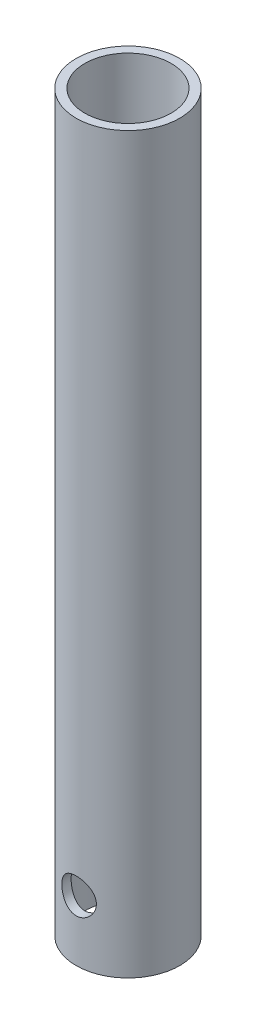
ISO-10303-21;
HEADER;
FILE_DESCRIPTION(('STEP AP214'),'2;1');
FILE_NAME('part.step','',(''),(''),'','','');
FILE_SCHEMA(('AUTOMOTIVE_DESIGN { 1 0 10303 214 1 1 1 1 }'));
ENDSEC;
DATA;
#1=APPLICATION_CONTEXT('core data for automotive mechanical design processes');
#2=APPLICATION_PROTOCOL_DEFINITION('international standard','automotive_design',2000,#1);
#3=PRODUCT_CONTEXT('',#1,'mechanical');
#4=PRODUCT('Part','Part','',(#3));
#5=PRODUCT_RELATED_PRODUCT_CATEGORY('part','',(#4));
#6=PRODUCT_DEFINITION_FORMATION('','',#4);
#7=PRODUCT_DEFINITION_CONTEXT('part definition',#1,'design');
#8=PRODUCT_DEFINITION('design','',#6,#7);
#9=PRODUCT_DEFINITION_SHAPE('','',#8);
#10=(LENGTH_UNIT() NAMED_UNIT(*) SI_UNIT(.MILLI.,.METRE.));
#11=(NAMED_UNIT(*) PLANE_ANGLE_UNIT() SI_UNIT($,.RADIAN.));
#12=(NAMED_UNIT(*) SI_UNIT($,.STERADIAN.) SOLID_ANGLE_UNIT());
#13=UNCERTAINTY_MEASURE_WITH_UNIT(LENGTH_MEASURE(1.E-05),#10,'distance_accuracy_value','');
#14=(GEOMETRIC_REPRESENTATION_CONTEXT(3) GLOBAL_UNCERTAINTY_ASSIGNED_CONTEXT((#13)) GLOBAL_UNIT_ASSIGNED_CONTEXT((#10,
#11,#12)) REPRESENTATION_CONTEXT('',''));
#15=CARTESIAN_POINT('',(0.,0.,0.));
#16=DIRECTION('',(0.,0.,1.));
#17=DIRECTION('',(1.,0.,0.));
#18=AXIS2_PLACEMENT_3D('',#15,#16,#17);
#19=CARTESIAN_POINT('',(0.,85.,0.));
#20=DIRECTION('',(0.,1.,0.));
#21=DIRECTION('',(0.,0.,1.));
#22=AXIS2_PLACEMENT_3D('',#19,#20,#21);
#23=PLANE('',#22);
#24=CARTESIAN_POINT('',(0.,85.,0.));
#25=DIRECTION('',(0.,1.,0.));
#26=DIRECTION('',(0.,0.,1.));
#27=AXIS2_PLACEMENT_3D('',#24,#25,#26);
#28=CIRCLE('',#27,6.);
#29=CARTESIAN_POINT('',(0.,85.,6.));
#30=VERTEX_POINT('',#29);
#31=EDGE_CURVE('E11',#30,#30,#28,.T.);
#32=ORIENTED_EDGE('',*,*,#31,.T.);
#33=EDGE_LOOP('',(#32));
#34=FACE_BOUND('',#33,.T.);
#35=CARTESIAN_POINT('',(0.,85.,0.));
#36=DIRECTION('',(0.,1.,0.));
#37=DIRECTION('',(1.,0.,0.));
#38=AXIS2_PLACEMENT_3D('',#35,#36,#37);
#39=CIRCLE('',#38,5.);
#40=CARTESIAN_POINT('',(5.,85.,0.));
#41=VERTEX_POINT('',#40);
#42=EDGE_CURVE('E58',#41,#41,#39,.T.);
#43=ORIENTED_EDGE('',*,*,#42,.F.);
#44=EDGE_LOOP('',(#43));
#45=FACE_BOUND('',#44,.T.);
#46=ADVANCED_FACE('F39',(#34,#45),#23,.T.);
#47=CARTESIAN_POINT('',(0.,0.,0.));
#48=DIRECTION('',(0.,1.,0.));
#49=DIRECTION('',(0.,0.,1.));
#50=AXIS2_PLACEMENT_3D('',#47,#48,#49);
#51=PLANE('',#50);
#52=CARTESIAN_POINT('',(0.,0.,0.));
#53=DIRECTION('',(0.,1.,0.));
#54=DIRECTION('',(0.,0.,1.));
#55=AXIS2_PLACEMENT_3D('',#52,#53,#54);
#56=CIRCLE('',#55,6.);
#57=CARTESIAN_POINT('',(0.,0.,6.));
#58=VERTEX_POINT('',#57);
#59=EDGE_CURVE('E53',#58,#58,#56,.T.);
#60=ORIENTED_EDGE('',*,*,#59,.F.);
#61=EDGE_LOOP('',(#60));
#62=FACE_BOUND('',#61,.T.);
#63=CARTESIAN_POINT('',(0.,0.,0.));
#64=DIRECTION('',(0.,1.,0.));
#65=DIRECTION('',(1.,0.,0.));
#66=AXIS2_PLACEMENT_3D('',#63,#64,#65);
#67=CIRCLE('',#66,5.);
#68=CARTESIAN_POINT('',(5.,0.,0.));
#69=VERTEX_POINT('',#68);
#70=EDGE_CURVE('E61',#69,#69,#67,.T.);
#71=ORIENTED_EDGE('',*,*,#70,.T.);
#72=EDGE_LOOP('',(#71));
#73=FACE_BOUND('',#72,.T.);
#74=ADVANCED_FACE('F97',(#62,#73),#51,.F.);
#75=CARTESIAN_POINT('',(0.,85.,0.));
#76=DIRECTION('',(0.,-1.,0.));
#77=DIRECTION('',(0.,0.,-1.));
#78=AXIS2_PLACEMENT_3D('',#75,#76,#77);
#79=CYLINDRICAL_SURFACE('',#78,6.);
#80=CARTESIAN_POINT('',(0.,8.99999999999998,-6.));
#81=CARTESIAN_POINT('',(-0.109126725773448,9.00000050746326,-6.00000030601888));
#82=CARTESIAN_POINT('',(-0.218250389077102,8.99103946774556,-5.9969953901509));
#83=CARTESIAN_POINT('',(-0.433283521745947,8.95554178236557,-5.98530420406562));
#84=CARTESIAN_POINT('',(-0.539192656237637,8.92900331210216,-5.97661734404305));
#85=CARTESIAN_POINT('',(-0.744665579003553,8.85936151323191,-5.95450615812885));
#86=CARTESIAN_POINT('',(-0.844239651772069,8.81628587508146,-5.94108975461707));
#87=CARTESIAN_POINT('',(-1.03474987361065,8.71491765432331,-5.91088891434684));
#88=CARTESIAN_POINT('',(-1.12568431391741,8.6566220699948,-5.89410381335556));
#89=CARTESIAN_POINT('',(-1.29948335004454,8.5243483902825,-5.8582818888601));
#90=CARTESIAN_POINT('',(-1.38200740059662,8.44993753147902,-5.8391911292757));
#91=CARTESIAN_POINT('',(-1.53366538540417,8.28846569058687,-5.80120629566243));
#92=CARTESIAN_POINT('',(-1.60279637097893,8.20140193014298,-5.78231226581098));
#93=CARTESIAN_POINT('',(-1.72764988445572,8.01402976960708,-5.74626664954547));
#94=CARTESIAN_POINT('',(-1.78292971644207,7.91341252053576,-5.72918078551376));
#95=CARTESIAN_POINT('',(-1.87563774775545,7.70364781108291,-5.69950610837202));
#96=CARTESIAN_POINT('',(-1.91307139477353,7.59450296567451,-5.68691592321491));
#97=CARTESIAN_POINT('',(-1.96774692301833,7.37465355700658,-5.66822606538754));
#98=CARTESIAN_POINT('',(-1.98562689654354,7.26412558302187,-5.66192191539222));
#99=CARTESIAN_POINT('',(-2.00268224666896,7.04147249168824,-5.65591313259015));
#100=CARTESIAN_POINT('',(-2.00186340320944,6.92934787858162,-5.6562064604546));
#101=CARTESIAN_POINT('',(-1.98203980740684,6.71212673911196,-5.6631803001636));
#102=CARTESIAN_POINT('',(-1.963867826334,6.60694319416196,-5.66956831735066));
#103=CARTESIAN_POINT('',(-1.91121232569884,6.40121316078633,-5.68753315449102));
#104=CARTESIAN_POINT('',(-1.87672685318375,6.30066722912986,-5.69911059568215));
#105=CARTESIAN_POINT('',(-1.79187811612043,6.10517450081704,-5.72635822262497));
#106=CARTESIAN_POINT('',(-1.74126809741453,6.01034394906095,-5.74209131586235));
#107=CARTESIAN_POINT('',(-1.62577821260628,5.83025818344054,-5.77585117151453));
#108=CARTESIAN_POINT('',(-1.56089422472802,5.74500574613323,-5.79387859580927));
#109=CARTESIAN_POINT('',(-1.41469866536448,5.58181680367845,-5.83134658335482));
#110=CARTESIAN_POINT('',(-1.33270630015263,5.50449461098186,-5.85081178709686));
#111=CARTESIAN_POINT('',(-1.15667913994013,5.3645374666732,-5.88813876774073));
#112=CARTESIAN_POINT('',(-1.06264319132163,5.301903923671,-5.90600039076135));
#113=CARTESIAN_POINT('',(-0.86389522609254,5.19260739952986,-5.93834215875587));
#114=CARTESIAN_POINT('',(-0.759086552832677,5.14610901731853,-5.95278700016078));
#115=CARTESIAN_POINT('',(-0.542538166729019,5.07159365208857,-5.9764113428887));
#116=CARTESIAN_POINT('',(-0.43080087630991,5.04357024915312,-5.98559267309759));
#117=CARTESIAN_POINT('',(-0.20876765905861,5.00788866795528,-5.99735254142881));
#118=CARTESIAN_POINT('',(-0.0986191997296947,4.99940038165449,-6.00020003667456));
#119=CARTESIAN_POINT('',(0.121550139920473,5.00066534719693,-5.99977805389655));
#120=CARTESIAN_POINT('',(0.2315710386393,5.01041551995975,-5.99650960838725));
#121=CARTESIAN_POINT('',(0.44503973260851,5.04722381547191,-5.98440049434209));
#122=CARTESIAN_POINT('',(0.548585613669686,5.07377241209898,-5.97572397422385));
#123=CARTESIAN_POINT('',(0.749711917159147,5.14278688893345,-5.9538369366014));
#124=CARTESIAN_POINT('',(0.847291577017213,5.18525479893556,-5.9406258409335));
#125=CARTESIAN_POINT('',(1.03657659278655,5.28614086368157,-5.91057862574579));
#126=CARTESIAN_POINT('',(1.12805991843429,5.34494918656633,-5.89365629511572));
#127=CARTESIAN_POINT('',(1.30012966027117,5.47638830002696,-5.85810507832525));
#128=CARTESIAN_POINT('',(1.38071273559116,5.54902331206352,-5.83947567187655));
#129=CARTESIAN_POINT('',(1.5325050156126,5.70995750201317,-5.80153695960889));
#130=CARTESIAN_POINT('',(1.60312193849154,5.79881845385372,-5.78223522174856));
#131=CARTESIAN_POINT('',(1.72851504464715,5.98754313562177,-5.74599946589417));
#132=CARTESIAN_POINT('',(1.78329109586203,6.08740695726815,-5.72906546764005));
#133=CARTESIAN_POINT('',(1.87519386083273,6.29534603057979,-5.69964783582767));
#134=CARTESIAN_POINT('',(1.91235626433005,6.40340415833753,-5.68715521585958));
#135=CARTESIAN_POINT('',(1.96778933351872,6.62475730008826,-5.66821664612899));
#136=CARTESIAN_POINT('',(1.98606850990788,6.7380499308087,-5.66176797247279));
#137=CARTESIAN_POINT('',(2.00255256495469,6.96039419208183,-5.65595717748354));
#138=CARTESIAN_POINT('',(2.0017405146168,7.06936468057364,-5.6562480051483));
#139=CARTESIAN_POINT('',(1.98248458689739,7.28553014984412,-5.66302539647735));
#140=CARTESIAN_POINT('',(1.96404175891718,7.39272523591018,-5.66951159138723));
#141=CARTESIAN_POINT('',(1.9107436262587,7.60027132600494,-5.68769048609783));
#142=CARTESIAN_POINT('',(1.87620669203103,7.70071365000899,-5.69928196044955));
#143=CARTESIAN_POINT('',(1.7919587315195,7.89445481387654,-5.72632797636937));
#144=CARTESIAN_POINT('',(1.74224433710762,7.98775206237601,-5.74178337526786));
#145=CARTESIAN_POINT('',(1.62652138516686,8.16896733984582,-5.77565658452093));
#146=CARTESIAN_POINT('',(1.55989648552917,8.25647300379677,-5.79417423284274));
#147=CARTESIAN_POINT('',(1.4132857662713,8.4193796267684,-5.83166712566506));
#148=CARTESIAN_POINT('',(1.33329616890297,8.49477715137615,-5.85064249824745));
#149=CARTESIAN_POINT('',(1.15848311384138,8.63428882457836,-5.88780061051088));
#150=CARTESIAN_POINT('',(1.06320302699946,8.697848695502,-5.90592363602513));
#151=CARTESIAN_POINT('',(0.862714714813253,8.8079808577013,-5.93851982345224));
#152=CARTESIAN_POINT('',(0.757509036264701,8.85455749184409,-5.9529939181586));
#153=CARTESIAN_POINT('',(0.544987294401957,8.92744326497735,-5.97611030137084));
#154=CARTESIAN_POINT('',(0.437975515352823,8.95456493252676,-5.98498424845045));
#155=CARTESIAN_POINT('',(0.220640832020498,8.99084056135425,-5.99692814128444));
#156=CARTESIAN_POINT('',(0.110318851137495,8.99999948699306,-5.9999996906381));
#157=CARTESIAN_POINT('',(0.,8.99999999999998,-6.));
#158=B_SPLINE_CURVE_WITH_KNOTS('',3,(#80,#81,#82,#83,#84,#85,#86,#87,#88,#89,#90,#91,#92,#93,
#94,#95,#96,#97,#98,#99,#100,#101,#102,#103,#104,#105,#106,#107,#108,#109,#110,#111,#112,#113,
#114,#115,#116,#117,#118,#119,#120,#121,#122,#123,#124,#125,#126,#127,#128,#129,#130,#131,#132,
#133,#134,#135,#136,#137,#138,#139,#140,#141,#142,#143,#144,#145,#146,#147,#148,#149,#150,#151,
#152,#153,#154,#155,#156,#157),.UNSPECIFIED.,.T.,.F.,(4,2,2,2,2,2,2,2,2,2,2,2,2,2,2,2,2,2,2,2,2,
2,2,2,2,2,2,2,2,2,2,2,2,2,2,2,2,2,4),(0.,0.326974212052023,0.653982370535041,0.980445345740547,
1.3069727555982,1.64369368565512,1.98048866575061,2.32696769646941,2.67334089385667,
3.00803851483681,3.34263267974971,3.66193653102561,3.98127861710965,4.30576342310262,
4.63034205116415,4.97186611622735,5.31342291933238,5.65836811300716,6.00319337754418,
6.33307166350341,6.66289426328354,6.98316315956428,7.30347290568209,7.63220799687474,
7.96104361643784,8.30482045761506,8.64860016469995,8.99168027653543,9.33460569411682,
9.65991332128519,9.98520158702753,10.3043117416084,10.6234927635196,10.9566013338361,
11.2898042224756,11.635993216702,11.9820936230492,12.3127311674763,12.6432773207628),.UNSPECIFIED.);
#159=CARTESIAN_POINT('',(0.,8.99999999999998,-6.));
#160=VERTEX_POINT('',#159);
#161=EDGE_CURVE('E86',#160,#160,#158,.T.);
#162=ORIENTED_EDGE('',*,*,#161,.T.);
#163=EDGE_LOOP('',(#162));
#164=FACE_BOUND('',#163,.T.);
#165=CARTESIAN_POINT('',(2.00000000000001,7.,5.65685424949238));
#166=CARTESIAN_POINT('',(2.00000051589543,6.89106365032786,5.65685389060868));
#167=CARTESIAN_POINT('',(1.99106956737105,6.78213040035281,5.66003538581715));
#168=CARTESIAN_POINT('',(1.95570226337762,6.5674911580115,5.6723514816251));
#169=CARTESIAN_POINT('',(1.9292630243368,6.46178570025506,5.68148706284377));
#170=CARTESIAN_POINT('',(1.85991097136981,6.25674621400542,5.70456407377583));
#171=CARTESIAN_POINT('',(1.8170304428065,6.15740014111457,5.71849607942643));
#172=CARTESIAN_POINT('',(1.71612325688277,5.96727990290408,5.74958244020649));
#173=CARTESIAN_POINT('',(1.65809325772037,5.87650763489273,5.76673750607225));
#174=CARTESIAN_POINT('',(1.52610229288576,5.70256007532337,5.80308978814946));
#175=CARTESIAN_POINT('',(1.45164868275584,5.61976914265654,5.82233789689288));
#176=CARTESIAN_POINT('',(1.28997533442879,5.46758639755072,5.86027729602006));
#177=CARTESIAN_POINT('',(1.20275355010476,5.39819673683526,5.87896849657923));
#178=CARTESIAN_POINT('',(1.01520901593002,5.27304220534081,5.91427733843598));
#179=CARTESIAN_POINT('',(0.914603822449054,5.21768005876408,5.93082815403211));
#180=CARTESIAN_POINT('',(0.704862445974951,5.12481682974497,5.95939173541966));
#181=CARTESIAN_POINT('',(0.595728571374427,5.08731093364618,5.97140572406004));
#182=CARTESIAN_POINT('',(0.376057634866991,5.03252829073521,5.98918150863813));
#183=CARTESIAN_POINT('',(0.265701509705939,5.01459310748598,5.99514629555118));
#184=CARTESIAN_POINT('',(0.0433957496481806,4.99736741327867,6.00087216436496));
#185=CARTESIAN_POINT('',(-0.0685534670877913,4.99807209669517,6.00063484525791));
#186=CARTESIAN_POINT('',(-0.286207030387629,5.01768850913205,5.99412079237463));
#187=CARTESIAN_POINT('',(-0.391984097183313,5.03588505694897,5.98808129510235));
#188=CARTESIAN_POINT('',(-0.598886877644344,5.08878596196094,5.97093934679463));
#189=CARTESIAN_POINT('',(-0.700012275558432,5.12349143795964,5.95983655262364));
#190=CARTESIAN_POINT('',(-0.896304949683947,5.20884263461211,5.93351340586449));
#191=CARTESIAN_POINT('',(-0.991376441937692,5.25969187709302,5.91824085048031));
#192=CARTESIAN_POINT('',(-1.17184865105465,5.37571941089731,5.88516786077838));
#193=CARTESIAN_POINT('',(-1.25724666877069,5.44090168665525,5.86736672402934));
#194=CARTESIAN_POINT('',(-1.42020173310262,5.58734878691939,5.83012383699793));
#195=CARTESIAN_POINT('',(-1.49720031413055,5.66922631568296,5.81064430337755));
#196=CARTESIAN_POINT('',(-1.63655451919635,5.84489745145323,5.77294670497801));
#197=CARTESIAN_POINT('',(-1.69890788656309,5.93869289145608,5.75472883491231));
#198=CARTESIAN_POINT('',(-1.80797491007149,6.13730725120688,5.72141050242224));
#199=CARTESIAN_POINT('',(-1.85445292724268,6.24226426263554,5.70635818569496));
#200=CARTESIAN_POINT('',(-1.92888638653868,6.45914278842883,5.68163301648769));
#201=CARTESIAN_POINT('',(-1.95684959149499,6.57106136241249,5.67195790974185));
#202=CARTESIAN_POINT('',(-1.99232256419505,6.79327671082315,5.6595927263117));
#203=CARTESIAN_POINT('',(-2.00069819101527,6.90341884949731,5.65660720637512));
#204=CARTESIAN_POINT('',(-1.99921087781944,7.12355229822821,5.65713344118369));
#205=CARTESIAN_POINT('',(-1.98935125045353,7.23354363204797,5.66064401583629));
#206=CARTESIAN_POINT('',(-1.95245130310463,7.44631393142382,5.67347236180599));
#207=CARTESIAN_POINT('',(-1.92601278796137,7.54921086030168,5.68258650881681));
#208=CARTESIAN_POINT('',(-1.85742772512094,7.74908721247837,5.70537107342046));
#209=CARTESIAN_POINT('',(-1.81527839272685,7.84606558318156,5.71904229869679));
#210=CARTESIAN_POINT('',(-1.71494868147788,8.034760841694,5.74993755191574));
#211=CARTESIAN_POINT('',(-1.656302236717,8.1262132852836,5.76726051331257));
#212=CARTESIAN_POINT('',(-1.52517126111512,8.29829210476744,5.8033153746193));
#213=CARTESIAN_POINT('',(-1.45268265099757,8.37891527732244,5.82204768887589));
#214=CARTESIAN_POINT('',(-1.29178341180066,8.53105596818128,5.85990077275698));
#215=CARTESIAN_POINT('',(-1.20277454109331,8.6019487800377,5.87899687155793));
#216=CARTESIAN_POINT('',(-1.01365458280052,8.72783228469609,5.91453703226218));
#217=CARTESIAN_POINT('',(-0.913543889729109,8.78282354232485,5.93098118835389));
#218=CARTESIAN_POINT('',(-0.705559724864595,8.87484020972343,5.95928811621206));
#219=CARTESIAN_POINT('',(-0.597742246642396,8.91198255429613,5.97118060009062));
#220=CARTESIAN_POINT('',(-0.376916931692035,8.96745548412021,5.98917221675549));
#221=CARTESIAN_POINT('',(-0.263910983907781,8.98579285976101,5.99527344068038));
#222=CARTESIAN_POINT('',(-0.0416306717200834,9.00252415521129,6.00083726472513));
#223=CARTESIAN_POINT('',(0.0675694478400361,9.00181490786476,6.00059840178878));
#224=CARTESIAN_POINT('',(0.284222290000347,8.98268538370719,5.99424393038796));
#225=CARTESIAN_POINT('',(0.391675153638113,8.96426654369447,5.98812879867152));
#226=CARTESIAN_POINT('',(0.600084238864117,8.91083553084808,5.97081829908825));
#227=CARTESIAN_POINT('',(0.701116541825578,8.87609156929414,5.95970516722297));
#228=CARTESIAN_POINT('',(0.895956701879591,8.7912449378057,5.9335432140899));
#229=CARTESIAN_POINT('',(0.989763248284865,8.74113948960598,5.91849368096033));
#230=CARTESIAN_POINT('',(1.17126803261757,8.62486097579599,5.88531737655762));
#231=CARTESIAN_POINT('',(1.25861250311522,8.55816262923672,5.86709744983853));
#232=CARTESIAN_POINT('',(1.42116205254486,8.41148521768761,5.82985977583759));
#233=CARTESIAN_POINT('',(1.49636324324919,8.33150191547455,5.81084177546194));
#234=CARTESIAN_POINT('',(1.63548361766624,8.1567812888261,5.77326559651196));
#235=CARTESIAN_POINT('',(1.6988459319958,8.06158897804672,5.75475455977261));
#236=CARTESIAN_POINT('',(1.80862868660223,7.86133114619444,5.72120386646031));
#237=CARTESIAN_POINT('',(1.85505355363895,7.75626821394067,5.70616330322498));
#238=CARTESIAN_POINT('',(1.92768765640834,7.54407635196874,5.68202668413029));
#239=CARTESIAN_POINT('',(1.95471581829904,7.43725547294927,5.67269265714364));
#240=CARTESIAN_POINT('',(1.99086864029854,7.2202878990666,5.66010767079036));
#241=CARTESIAN_POINT('',(1.99999947839319,7.11014236517858,5.65685461234922));
#242=CARTESIAN_POINT('',(2.00000000000001,7.,5.65685424949238));
#243=B_SPLINE_CURVE_WITH_KNOTS('',3,(#165,#166,#167,#168,#169,#170,#171,#172,#173,#174,#175,
#176,#177,#178,#179,#180,#181,#182,#183,#184,#185,#186,#187,#188,#189,#190,#191,#192,#193,#194,
#195,#196,#197,#198,#199,#200,#201,#202,#203,#204,#205,#206,#207,#208,#209,#210,#211,#212,#213,
#214,#215,#216,#217,#218,#219,#220,#221,#222,#223,#224,#225,#226,#227,#228,#229,#230,#231,#232,
#233,#234,#235,#236,#237,#238,#239,#240,#241,#242),.UNSPECIFIED.,.T.,.F.,(4,2,2,2,2,2,2,2,2,2,2,
2,2,2,2,2,2,2,2,2,2,2,2,2,2,2,2,2,2,2,2,2,2,2,2,2,2,2,4),(0.,0.326401169598712,
0.652856110030328,0.978673255001656,1.30456233237089,1.64202674855137,1.97954530343976,
2.32587012287315,2.67210152773579,3.00628637529869,3.34038506604655,3.66138009651139,
3.98239688378474,4.30763309720671,4.63295983748045,4.97360348727836,5.31429959224213,
5.65985279686112,6.00526102713233,6.3350858272888,6.66485071674469,6.98328791537554,
7.30178158293893,7.63037715471431,7.95906971324256,8.30357616342187,8.64807037515067,
8.99027582381705,9.33235766008315,9.65836169355273,9.98433928019565,10.3051391208086,
10.6259970152649,10.9587103904127,11.2915300886527,11.6373780547229,11.9831355653374,
12.3132642432538,12.6432789438093),.UNSPECIFIED.);
#244=CARTESIAN_POINT('',(2.00000000000001,7.,5.65685424949238));
#245=VERTEX_POINT('',#244);
#246=EDGE_CURVE('E81',#245,#245,#243,.T.);
#247=ORIENTED_EDGE('',*,*,#246,.T.);
#248=EDGE_LOOP('',(#247));
#249=FACE_BOUND('',#248,.T.);
#250=ORIENTED_EDGE('',*,*,#31,.F.);
#251=EDGE_LOOP('',(#250));
#252=FACE_BOUND('',#251,.T.);
#253=ORIENTED_EDGE('',*,*,#59,.T.);
#254=EDGE_LOOP('',(#253));
#255=FACE_BOUND('',#254,.T.);
#256=ADVANCED_FACE('F41',(#164,#249,#252,#255),#79,.T.);
#257=CARTESIAN_POINT('',(0.,85.,0.));
#258=DIRECTION('',(0.,-1.,0.));
#259=DIRECTION('',(0.,0.,-1.));
#260=AXIS2_PLACEMENT_3D('',#257,#258,#259);
#261=CYLINDRICAL_SURFACE('',#260,5.);
#262=CARTESIAN_POINT('',(0.,8.99999999999998,-5.));
#263=CARTESIAN_POINT('',(-0.107493005442893,8.99999014817624,-4.99999271227085));
#264=CARTESIAN_POINT('',(-0.215172564090678,8.99128224791162,-4.99649294306933));
#265=CARTESIAN_POINT('',(-0.427496480417901,8.95675229647878,-4.98283453100642));
#266=CARTESIAN_POINT('',(-0.532131777561251,8.93088372091387,-4.97265778698877));
#267=CARTESIAN_POINT('',(-0.734953922727403,8.86312392194117,-4.94674209213119));
#268=CARTESIAN_POINT('',(-0.833160661616958,8.82128515378327,-4.93102136364072));
#269=CARTESIAN_POINT('',(-1.02107197032837,8.72298082667346,-4.89556610796078));
#270=CARTESIAN_POINT('',(-1.11077947675099,8.66652034508108,-4.87583297458057));
#271=CARTESIAN_POINT('',(-1.2835010075704,8.53776450143907,-4.83330886170419));
#272=CARTESIAN_POINT('',(-1.36606227255022,8.46489334375974,-4.8104229692919));
#273=CARTESIAN_POINT('',(-1.51817500478473,8.30659999652323,-4.76460576906194));
#274=CARTESIAN_POINT('',(-1.58772010713354,8.22117170278826,-4.74167444453792));
#275=CARTESIAN_POINT('',(-1.71487456729288,8.03557192975774,-4.69722791797136));
#276=CARTESIAN_POINT('',(-1.77181498119548,7.9349135139768,-4.67582115964951));
#277=CARTESIAN_POINT('',(-1.86775471903715,7.72446360157996,-4.63833647186792));
#278=CARTESIAN_POINT('',(-1.90676256428584,7.61467647215164,-4.62225601244176));
#279=CARTESIAN_POINT('',(-1.96389882339587,7.3942876664079,-4.59826357660818));
#280=CARTESIAN_POINT('',(-1.98289396580565,7.28394876442379,-4.59001420355605));
#281=CARTESIAN_POINT('',(-2.00217296164003,7.06136500169273,-4.58164004049144));
#282=CARTESIAN_POINT('',(-2.00246601631323,6.94912110537498,-4.58151125522768));
#283=CARTESIAN_POINT('',(-1.98498936750455,6.73424332854195,-4.58910500279994));
#284=CARTESIAN_POINT('',(-1.96847531430514,6.63148428559097,-4.5962817503845));
#285=CARTESIAN_POINT('',(-1.91994688029782,6.43034044399328,-4.61676187607836));
#286=CARTESIAN_POINT('',(-1.88792979480464,6.33195641188969,-4.63006632321673));
#287=CARTESIAN_POINT('',(-1.80869473255108,6.13998216380396,-4.6615948508853));
#288=CARTESIAN_POINT('',(-1.76117986231532,6.04653076094531,-4.67991379280788));
#289=CARTESIAN_POINT('',(-1.65250646073222,5.86858418363843,-4.7193811638989));
#290=CARTESIAN_POINT('',(-1.59134280510085,5.78409239059719,-4.74053065456848));
#291=CARTESIAN_POINT('',(-1.45155059945444,5.619590271198,-4.78526736742271));
#292=CARTESIAN_POINT('',(-1.37193746297064,5.54043127055398,-4.80891664976152));
#293=CARTESIAN_POINT('',(-1.2003144274302,5.39631552199796,-4.85459824958282));
#294=CARTESIAN_POINT('',(-1.10830206533444,5.3313616025897,-4.87663024445325));
#295=CARTESIAN_POINT('',(-0.912077652605846,5.21638255258416,-4.91714681264548));
#296=CARTESIAN_POINT('',(-0.80766049134648,5.16667771880294,-4.93555270095415));
#297=CARTESIAN_POINT('',(-0.591023765482884,5.08583213892194,-4.96614828328759));
#298=CARTESIAN_POINT('',(-0.478808196849676,5.05468196244258,-4.97834113462382));
#299=CARTESIAN_POINT('',(-0.256895887607821,5.01355170458029,-4.99456139506911));
#300=CARTESIAN_POINT('',(-0.147443293985535,5.00242754574644,-4.99902945833514));
#301=CARTESIAN_POINT('',(0.0718453098078175,4.99828689947138,-5.00068478510631));
#302=CARTESIAN_POINT('',(0.181681213223924,5.00526571845248,-4.99787393582292));
#303=CARTESIAN_POINT('',(0.393432739121988,5.03629175255199,-4.98557567063753));
#304=CARTESIAN_POINT('',(0.495482491775475,5.05955798035097,-4.97639391345523));
#305=CARTESIAN_POINT('',(0.694135428060782,5.12143570830981,-4.952594414055));
#306=CARTESIAN_POINT('',(0.790737910224846,5.16004917966867,-4.93797597356531));
#307=CARTESIAN_POINT('',(0.979078785816704,5.25278493967994,-4.90416594770812));
#308=CARTESIAN_POINT('',(1.07057802275541,5.30734547204314,-4.88484815979804));
#309=CARTESIAN_POINT('',(1.24344359124656,5.42994032390564,-4.84373364745525));
#310=CARTESIAN_POINT('',(1.32480584076113,5.49798004292261,-4.8219359311027));
#311=CARTESIAN_POINT('',(1.48072304302882,5.65087001294962,-4.77645117638112));
#312=CARTESIAN_POINT('',(1.55447393380607,5.7365335415062,-4.75273441425052));
#313=CARTESIAN_POINT('',(1.68675119741372,5.91944008300936,-4.70741672917132));
#314=CARTESIAN_POINT('',(1.74527506133751,6.01668500033994,-4.68581615526511));
#315=CARTESIAN_POINT('',(1.84580750193163,6.2214616945941,-4.64714299907708));
#316=CARTESIAN_POINT('',(1.88765059453446,6.32908399921231,-4.63011630884788));
#317=CARTESIAN_POINT('',(1.95229621970531,6.55073365171515,-4.60323673477931));
#318=CARTESIAN_POINT('',(1.97511280526932,6.66475620581242,-4.59337855695998));
#319=CARTESIAN_POINT('',(1.99971561727841,6.88712790177454,-4.58271759299926));
#320=CARTESIAN_POINT('',(2.00289708230287,6.99529483959335,-4.58131421008171));
#321=CARTESIAN_POINT('',(1.99180315927753,7.21054485771329,-4.58614836033098));
#322=CARTESIAN_POINT('',(1.97752998791379,7.31762807390258,-4.59238492324793));
#323=CARTESIAN_POINT('',(1.93307136615365,7.52333218985504,-4.61126649079021));
#324=CARTESIAN_POINT('',(1.90353749357098,7.622120274433,-4.62364831827449));
#325=CARTESIAN_POINT('',(1.83000544849102,7.81337862961348,-4.65324001232696));
#326=CARTESIAN_POINT('',(1.78600328139382,7.90584714689983,-4.67045121206007));
#327=CARTESIAN_POINT('',(1.68187276275974,8.08760961927078,-4.70898609604491));
#328=CARTESIAN_POINT('',(1.62096533515949,8.17641867013049,-4.73048882313242));
#329=CARTESIAN_POINT('',(1.4858921192715,8.34299331720376,-4.77463804372237));
#330=CARTESIAN_POINT('',(1.41172233481813,8.42075557212832,-4.79728488048406));
#331=CARTESIAN_POINT('',(1.24650550627247,8.56820285326362,-4.84293567087394));
#332=CARTESIAN_POINT('',(1.15467600114614,8.63703730689807,-4.86586757962185));
#333=CARTESIAN_POINT('',(0.959900320285784,8.75833704262164,-4.90800406713717));
#334=CARTESIAN_POINT('',(0.856949004547241,8.81079471215253,-4.92720691092906));
#335=CARTESIAN_POINT('',(0.644738062495204,8.89662221519029,-4.95939714815861));
#336=CARTESIAN_POINT('',(0.535631618219695,8.93032932356034,-4.97249363055028));
#337=CARTESIAN_POINT('',(0.312876546281219,8.97863912095428,-4.99144306209366));
#338=CARTESIAN_POINT('',(0.199243525858913,8.99330243674393,-4.99731899495638));
#339=CARTESIAN_POINT('',(0.0569122978909303,8.99939538097827,-4.99975899504137));
#340=CARTESIAN_POINT('',(0.0284626887407587,9.00000260862918,-5.00000192969176));
#341=CARTESIAN_POINT('',(0.,8.99999999999998,-5.));
#342=B_SPLINE_CURVE_WITH_KNOTS('',3,(#262,#263,#264,#265,#266,#267,#268,#269,#270,#271,#272,
#273,#274,#275,#276,#277,#278,#279,#280,#281,#282,#283,#284,#285,#286,#287,#288,#289,#290,#291,
#292,#293,#294,#295,#296,#297,#298,#299,#300,#301,#302,#303,#304,#305,#306,#307,#308,#309,#310,
#311,#312,#313,#314,#315,#316,#317,#318,#319,#320,#321,#322,#323,#324,#325,#326,#327,#328,#329,
#330,#331,#332,#333,#334,#335,#336,#337,#338,#339,#340,#341),.UNSPECIFIED.,.T.,.F.,(4,2,2,2,2,2,
2,2,2,2,2,2,2,2,2,2,2,2,2,2,2,2,2,2,2,2,2,2,2,2,2,2,2,2,2,2,2,2,2,4),(0.,0.322402987893076,
0.645683636007934,0.967911457471577,1.29002753567984,1.62597381700397,1.96208394934412,
2.31315258819217,2.66405423118268,2.99904105308829,3.33386306340489,3.64538328401373,
3.95695787256048,4.27489126298817,4.59294421938184,4.93558349186558,5.27829092839734,
5.62776913162808,5.97706956113792,6.30569184528009,6.63422893570084,6.94800455564367,
7.26182048993798,7.58523513398264,7.90877959498971,8.25368474624416,8.5986466904375,
8.9469504514083,9.29499672645936,9.6179967339275,9.94095572563048,10.2511431854877,
10.5614163580516,10.8894546805669,11.217592013484,11.5670042353384,11.9165786364054,
12.2596430101332,12.6016125240435,12.686980458968),.UNSPECIFIED.);
#343=CARTESIAN_POINT('',(0.,8.99999999999998,-5.));
#344=VERTEX_POINT('',#343);
#345=EDGE_CURVE('E44',#344,#344,#342,.T.);
#346=ORIENTED_EDGE('',*,*,#345,.F.);
#347=EDGE_LOOP('',(#346));
#348=FACE_BOUND('',#347,.T.);
#349=CARTESIAN_POINT('',(2.00000000000001,7.,4.58257569495584));
#350=CARTESIAN_POINT('',(1.99999540068023,6.89287631028704,4.58258022779737));
#351=CARTESIAN_POINT('',(1.99134173553407,6.78557370566815,4.58638433797122));
#352=CARTESIAN_POINT('',(1.95706710874824,6.57406091590043,4.601110833066));
#353=CARTESIAN_POINT('',(1.93140279032341,6.46985934566148,4.61205140628347));
#354=CARTESIAN_POINT('',(1.86423554476216,6.26794819102917,4.63960410719222));
#355=CARTESIAN_POINT('',(1.82279228998551,6.17021575670878,4.65619484260882));
#356=CARTESIAN_POINT('',(1.72542013194153,5.9831146451377,4.69314677188873));
#357=CARTESIAN_POINT('',(1.66949439157707,5.89374414747589,4.71350714220611));
#358=CARTESIAN_POINT('',(1.54132201423255,5.72073968545566,4.75700861562336));
#359=CARTESIAN_POINT('',(1.46837936836551,5.63764360060275,4.78023917022606));
#360=CARTESIAN_POINT('',(1.30970909513216,5.48447097914419,4.82612457915277));
#361=CARTESIAN_POINT('',(1.22397701877347,5.41439899229029,4.84877922991761));
#362=CARTESIAN_POINT('',(1.03800631337303,5.28659360969029,4.89203407641395));
#363=CARTESIAN_POINT('',(0.937328966419098,5.22945570031406,4.9125180361257));
#364=CARTESIAN_POINT('',(0.726825322068643,5.13315642982621,4.94803927702516));
#365=CARTESIAN_POINT('',(0.617002769076887,5.09398775375113,4.96307877403249));
#366=CARTESIAN_POINT('',(0.396966427039757,5.03665851400691,4.98538324990609));
#367=CARTESIAN_POINT('',(0.287028984858319,5.01757268602978,4.99298936770628));
#368=CARTESIAN_POINT('',(0.0652663285839643,4.99797151421854,5.00080310687431));
#369=CARTESIAN_POINT('',(-0.0465581658394094,4.9974492440342,5.00101348770556));
#370=CARTESIAN_POINT('',(-0.262232494702088,5.01448276980419,4.99421962820612));
#371=CARTESIAN_POINT('',(-0.366177452870456,5.03102477275471,4.98761996771485));
#372=CARTESIAN_POINT('',(-0.569673109221914,5.07999287630296,4.96849291469141));
#373=CARTESIAN_POINT('',(-0.669223484391239,5.11242014239846,4.95596508721342));
#374=CARTESIAN_POINT('',(-0.862897938510559,5.19263648287825,4.92596824457467));
#375=CARTESIAN_POINT('',(-0.956917623378897,5.24064971481538,4.90842760466223));
#376=CARTESIAN_POINT('',(-1.13580815074131,5.35046500691915,4.87014585180275));
#377=CARTESIAN_POINT('',(-1.22067584271796,5.41227179310016,4.84940364267149));
#378=CARTESIAN_POINT('',(-1.38476882799018,5.55264913594388,4.80521637176122));
#379=CARTESIAN_POINT('',(-1.46325784526632,5.63205389257279,4.78168326511759));
#380=CARTESIAN_POINT('',(-1.60610741539265,5.802990571832,4.73561660973263));
#381=CARTESIAN_POINT('',(-1.67046334378699,5.8945264481956,4.71308339008076));
#382=CARTESIAN_POINT('',(-1.78490418871928,6.09041902237393,4.67096897409023));
#383=CARTESIAN_POINT('',(-1.83453465163627,6.19506483033865,4.65148914057708));
#384=CARTESIAN_POINT('',(-1.91517625986646,6.41221549031222,4.61887590344084));
#385=CARTESIAN_POINT('',(-1.94619949837799,6.52471518472658,4.60573837891311));
#386=CARTESIAN_POINT('',(-1.9869549488549,6.74703577746743,4.58829759702716));
#387=CARTESIAN_POINT('',(-1.99787209681455,6.85660044712856,4.58350366456138));
#388=CARTESIAN_POINT('',(-2.00156132644289,7.07607720775956,4.58189497869038));
#389=CARTESIAN_POINT('',(-1.99433891059129,7.18598918327565,4.58507780560362));
#390=CARTESIAN_POINT('',(-1.96303289479004,7.39645893495694,4.59856044359113));
#391=CARTESIAN_POINT('',(-1.93993306202387,7.49719293740006,4.60844457798301));
#392=CARTESIAN_POINT('',(-1.87880418691088,7.69328840478545,4.6337005102734));
#393=CARTESIAN_POINT('',(-1.84077183430228,7.78864867310715,4.64907352488598));
#394=CARTESIAN_POINT('',(-1.74913563948158,7.97560235779566,4.68433781860101));
#395=CARTESIAN_POINT('',(-1.69496286826465,8.06688618869454,4.70438704639177));
#396=CARTESIAN_POINT('',(-1.57316522444183,8.23948298744159,4.74650385157795));
#397=CARTESIAN_POINT('',(-1.5055348734819,8.32079187279545,4.76857224896045));
#398=CARTESIAN_POINT('',(-1.35284421168058,8.47737340859937,4.81420915971416));
#399=CARTESIAN_POINT('',(-1.26686542944544,8.5517565652916,4.83776807285233));
#400=CARTESIAN_POINT('',(-1.08308363336851,8.68517707660977,4.88219794567532));
#401=CARTESIAN_POINT('',(-0.985280138466614,8.74421380659512,4.90306879593136));
#402=CARTESIAN_POINT('',(-0.78027993400302,8.84504762646334,4.9398371590039));
#403=CARTESIAN_POINT('',(-0.67308548099875,8.88684884417367,4.9557358624066));
#404=CARTESIAN_POINT('',(-0.452393590914552,8.95154885239976,4.98072713468904));
#405=CARTESIAN_POINT('',(-0.338899610276823,8.97445790141069,4.98982339706103));
#406=CARTESIAN_POINT('',(-0.116816510362618,8.99950470165285,4.99979008211858));
#407=CARTESIAN_POINT('',(-0.00839049265208988,9.00290012856203,5.00115846749745));
#408=CARTESIAN_POINT('',(0.207433835792263,8.99214452061654,4.99686042373721));
#409=CARTESIAN_POINT('',(0.314832299614385,8.97799614184443,4.99119505948774));
#410=CARTESIAN_POINT('',(0.522170901733396,8.93345321200012,4.97371513381836));
#411=CARTESIAN_POINT('',(0.622238803864867,8.90357105524345,4.96209480698998));
#412=CARTESIAN_POINT('',(0.815922355542602,8.82894719411893,4.93394947767358));
#413=CARTESIAN_POINT('',(0.909536811189122,8.78420274906091,4.91742357062859));
#414=CARTESIAN_POINT('',(1.09220303880515,8.67889680664677,4.88018094611867));
#415=CARTESIAN_POINT('',(1.18087037518738,8.61772372467487,4.859311306872));
#416=CARTESIAN_POINT('',(1.34705404014794,8.48221146125301,4.8158940222708));
#417=CARTESIAN_POINT('',(1.42456572919735,8.40786683039179,4.79334568464253));
#418=CARTESIAN_POINT('',(1.57120121894449,8.24268485315135,4.7473776736768));
#419=CARTESIAN_POINT('',(1.63950871002776,8.15111142485591,4.72399047228096));
#420=CARTESIAN_POINT('',(1.7598476276315,7.95705756427918,4.68049656850749));
#421=CARTESIAN_POINT('',(1.81187714055768,7.85457585154646,4.66039025195448));
#422=CARTESIAN_POINT('',(1.89399048451635,7.65096381352981,4.62758914239063));
#423=CARTESIAN_POINT('',(1.92562535665268,7.55053839728756,4.61439096680415));
#424=CARTESIAN_POINT('',(1.9727199092849,7.34551095850736,4.5944582603412));
#425=CARTESIAN_POINT('',(1.98822466191608,7.24092142657565,4.58770572290435));
#426=CARTESIAN_POINT('',(1.99692202185513,7.11322176088848,4.5839176394209));
#427=CARTESIAN_POINT('',(1.99807530751896,7.09059851964357,4.58341531117284));
#428=CARTESIAN_POINT('',(1.99961481124251,7.04531952320278,4.58274384722722));
#429=CARTESIAN_POINT('',(2.0000009730612,7.02266376574484,4.5825747359592));
#430=CARTESIAN_POINT('',(2.00000000000001,7.,4.58257569495584));
#431=B_SPLINE_CURVE_WITH_KNOTS('',3,(#349,#350,#351,#352,#353,#354,#355,#356,#357,#358,#359,
#360,#361,#362,#363,#364,#365,#366,#367,#368,#369,#370,#371,#372,#373,#374,#375,#376,#377,#378,
#379,#380,#381,#382,#383,#384,#385,#386,#387,#388,#389,#390,#391,#392,#393,#394,#395,#396,#397,
#398,#399,#400,#401,#402,#403,#404,#405,#406,#407,#408,#409,#410,#411,#412,#413,#414,#415,#416,
#417,#418,#419,#420,#421,#422,#423,#424,#425,#426,#427,#428,#429,#430),.UNSPECIFIED.,.T.,.F.,(4,
2,2,2,2,2,2,2,2,2,2,2,2,2,2,2,2,2,2,2,2,2,2,2,2,2,2,2,2,2,2,2,2,2,2,2,2,2,2,2,4),(0.,
0.321277648767654,0.643377335822246,0.964270823293392,1.28509428823862,1.62255618284425,
1.96013574348343,2.31102669091429,2.66177466969481,2.99554182887184,3.32918445305673,
3.64408644830303,3.9590115512906,4.27868300234899,4.59846414940032,4.93924044081357,
5.28012807127128,5.63064458717259,5.98093304800103,6.30982147524422,6.63861014907941,
6.94867248085147,7.2588035865164,7.58151154652703,7.90435114525851,8.25103734246981,
8.5977376485275,8.94435487312814,9.29078375954138,9.61461039755955,9.93838801512604,
10.2522199444335,10.5661097782859,10.8938705113993,11.2217671656421,11.5699625328562,
11.9181988175919,12.2351666081908,12.5512463021925,12.619212852096,12.6871843847256),.UNSPECIFIED.);
#432=CARTESIAN_POINT('',(2.00000000000001,7.,4.58257569495584));
#433=VERTEX_POINT('',#432);
#434=EDGE_CURVE('E63',#433,#433,#431,.T.);
#435=ORIENTED_EDGE('',*,*,#434,.F.);
#436=EDGE_LOOP('',(#435));
#437=FACE_BOUND('',#436,.T.);
#438=ORIENTED_EDGE('',*,*,#42,.T.);
#439=EDGE_LOOP('',(#438));
#440=FACE_BOUND('',#439,.T.);
#441=ORIENTED_EDGE('',*,*,#70,.F.);
#442=EDGE_LOOP('',(#441));
#443=FACE_BOUND('',#442,.T.);
#444=ADVANCED_FACE('F68',(#348,#437,#440,#443),#261,.F.);
#445=CARTESIAN_POINT('',(0.,7.,-6.));
#446=DIRECTION('',(0.,0.,1.));
#447=DIRECTION('',(1.,0.,0.));
#448=AXIS2_PLACEMENT_3D('',#445,#446,#447);
#449=CYLINDRICAL_SURFACE('',#448,2.00000000000001);
#450=ORIENTED_EDGE('',*,*,#434,.T.);
#451=EDGE_LOOP('',(#450));
#452=FACE_BOUND('',#451,.T.);
#453=ORIENTED_EDGE('',*,*,#246,.F.);
#454=EDGE_LOOP('',(#453));
#455=FACE_BOUND('',#454,.T.);
#456=ADVANCED_FACE('F74',(#452,#455),#449,.F.);
#457=ORIENTED_EDGE('',*,*,#345,.T.);
#458=EDGE_LOOP('',(#457));
#459=FACE_BOUND('',#458,.T.);
#460=ORIENTED_EDGE('',*,*,#161,.F.);
#461=EDGE_LOOP('',(#460));
#462=FACE_BOUND('',#461,.T.);
#463=ADVANCED_FACE('F71',(#459,#462),#449,.F.);
#464=CLOSED_SHELL('',(#46,#74,#256,#444,#456,#463));
#465=MANIFOLD_SOLID_BREP('B2',#464);
#466=ADVANCED_BREP_SHAPE_REPRESENTATION('',(#18,#465),#14);
#467=SHAPE_DEFINITION_REPRESENTATION(#9,#466);
ENDSEC;
END-ISO-10303-21;
